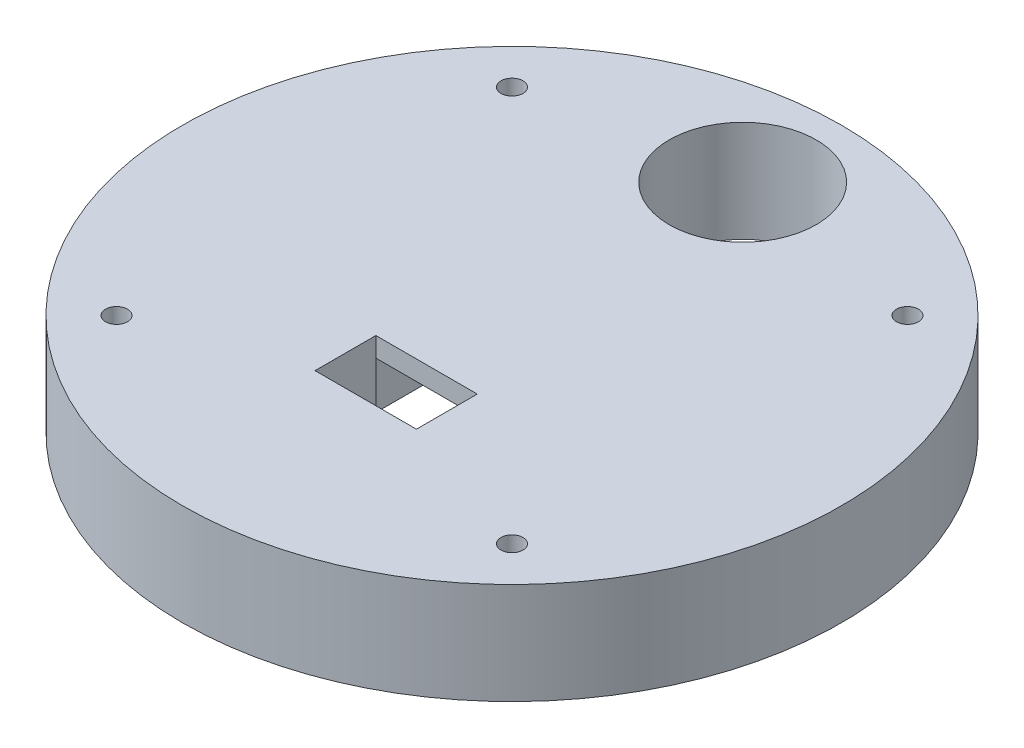
ISO-10303-21;
HEADER;
FILE_DESCRIPTION(('STEP AP214'),'2;1');
FILE_NAME('part.step','',(''),(''),'','','');
FILE_SCHEMA(('AUTOMOTIVE_DESIGN { 1 0 10303 214 1 1 1 1 }'));
ENDSEC;
DATA;
#1=APPLICATION_CONTEXT('core data for automotive mechanical design processes');
#2=APPLICATION_PROTOCOL_DEFINITION('international standard','automotive_design',2000,#1);
#3=PRODUCT_CONTEXT('',#1,'mechanical');
#4=PRODUCT('Part','Part','',(#3));
#5=PRODUCT_RELATED_PRODUCT_CATEGORY('part','',(#4));
#6=PRODUCT_DEFINITION_FORMATION('','',#4);
#7=PRODUCT_DEFINITION_CONTEXT('part definition',#1,'design');
#8=PRODUCT_DEFINITION('design','',#6,#7);
#9=PRODUCT_DEFINITION_SHAPE('','',#8);
#10=(LENGTH_UNIT() NAMED_UNIT(*) SI_UNIT(.MILLI.,.METRE.));
#11=(NAMED_UNIT(*) PLANE_ANGLE_UNIT() SI_UNIT($,.RADIAN.));
#12=(NAMED_UNIT(*) SI_UNIT($,.STERADIAN.) SOLID_ANGLE_UNIT());
#13=UNCERTAINTY_MEASURE_WITH_UNIT(LENGTH_MEASURE(1.E-05),#10,'distance_accuracy_value','');
#14=(GEOMETRIC_REPRESENTATION_CONTEXT(3) GLOBAL_UNCERTAINTY_ASSIGNED_CONTEXT((#13)) GLOBAL_UNIT_ASSIGNED_CONTEXT((#10,
#11,#12)) REPRESENTATION_CONTEXT('',''));
#15=CARTESIAN_POINT('',(0.,0.,0.));
#16=DIRECTION('',(0.,0.,1.));
#17=DIRECTION('',(1.,0.,0.));
#18=AXIS2_PLACEMENT_3D('',#15,#16,#17);
#19=CARTESIAN_POINT('',(0.,20.5,21.3995));
#20=DIRECTION('',(0.,0.,1.));
#21=DIRECTION('',(1.,0.,0.));
#22=AXIS2_PLACEMENT_3D('',#19,#20,#21);
#23=PLANE('',#22);
#24=DIRECTION('',(-1.,0.,0.));
#25=VECTOR('',#24,1.);
#26=CARTESIAN_POINT('',(0.,20.5,21.3995));
#27=LINE('',#26,#25);
#28=CARTESIAN_POINT('',(-12.7,20.5,21.3995));
#29=VERTEX_POINT('',#28);
#30=CARTESIAN_POINT('',(-21.3995,20.5,21.3995));
#31=VERTEX_POINT('',#30);
#32=EDGE_CURVE('E182',#29,#31,#27,.T.);
#33=ORIENTED_EDGE('',*,*,#32,.F.);
#34=DIRECTION('',(0.,-1.,0.));
#35=VECTOR('',#34,1.);
#36=CARTESIAN_POINT('',(-12.7,25.4,21.3995));
#37=LINE('',#36,#35);
#38=CARTESIAN_POINT('',(-12.7,0.,21.3995));
#39=VERTEX_POINT('',#38);
#40=EDGE_CURVE('E126',#29,#39,#37,.T.);
#41=ORIENTED_EDGE('',*,*,#40,.T.);
#42=DIRECTION('',(-1.,0.,0.));
#43=VECTOR('',#42,1.);
#44=CARTESIAN_POINT('',(0.,0.,21.3995));
#45=LINE('',#44,#43);
#46=CARTESIAN_POINT('',(-21.3995,0.,21.3995));
#47=VERTEX_POINT('',#46);
#48=EDGE_CURVE('E200',#39,#47,#45,.T.);
#49=ORIENTED_EDGE('',*,*,#48,.T.);
#50=DIRECTION('',(0.,-1.,0.));
#51=VECTOR('',#50,1.);
#52=CARTESIAN_POINT('',(-21.3995,20.5,21.3995));
#53=LINE('',#52,#51);
#54=EDGE_CURVE('E214',#31,#47,#53,.T.);
#55=ORIENTED_EDGE('',*,*,#54,.F.);
#56=EDGE_LOOP('',(#33,#41,#49,#55));
#57=FACE_BOUND('',#56,.T.);
#58=ADVANCED_FACE('F47',(#57),#23,.F.);
#59=CARTESIAN_POINT('',(0.,0.,0.));
#60=DIRECTION('',(0.,1.,0.));
#61=DIRECTION('',(0.,0.,1.));
#62=AXIS2_PLACEMENT_3D('',#59,#60,#61);
#63=PLANE('',#62);
#64=CARTESIAN_POINT('',(49.53,0.,49.53));
#65=DIRECTION('',(0.,1.,0.));
#66=DIRECTION('',(0.,0.,1.));
#67=AXIS2_PLACEMENT_3D('',#64,#65,#66);
#68=CIRCLE('',#67,2.75);
#69=CARTESIAN_POINT('',(49.53,0.,52.28));
#70=VERTEX_POINT('',#69);
#71=EDGE_CURVE('E598',#70,#70,#68,.T.);
#72=ORIENTED_EDGE('',*,*,#71,.T.);
#73=EDGE_LOOP('',(#72));
#74=FACE_BOUND('',#73,.T.);
#75=CARTESIAN_POINT('',(-49.53,0.,-49.53));
#76=DIRECTION('',(0.,1.,0.));
#77=DIRECTION('',(0.,0.,1.));
#78=AXIS2_PLACEMENT_3D('',#75,#76,#77);
#79=CIRCLE('',#78,2.75);
#80=CARTESIAN_POINT('',(-49.53,0.,-46.78));
#81=VERTEX_POINT('',#80);
#82=EDGE_CURVE('E590',#81,#81,#79,.T.);
#83=ORIENTED_EDGE('',*,*,#82,.T.);
#84=EDGE_LOOP('',(#83));
#85=FACE_BOUND('',#84,.T.);
#86=CARTESIAN_POINT('',(49.53,0.,-49.53));
#87=DIRECTION('',(0.,1.,0.));
#88=DIRECTION('',(0.,0.,1.));
#89=AXIS2_PLACEMENT_3D('',#86,#87,#88);
#90=CIRCLE('',#89,2.75);
#91=CARTESIAN_POINT('',(49.53,0.,-46.78));
#92=VERTEX_POINT('',#91);
#93=EDGE_CURVE('E584',#92,#92,#90,.T.);
#94=ORIENTED_EDGE('',*,*,#93,.T.);
#95=EDGE_LOOP('',(#94));
#96=FACE_BOUND('',#95,.T.);
#97=CARTESIAN_POINT('',(-49.53,0.,49.53));
#98=DIRECTION('',(0.,1.,0.));
#99=DIRECTION('',(0.,0.,1.));
#100=AXIS2_PLACEMENT_3D('',#97,#98,#99);
#101=CIRCLE('',#100,2.75);
#102=CARTESIAN_POINT('',(-49.53,0.,52.28));
#103=VERTEX_POINT('',#102);
#104=EDGE_CURVE('E150',#103,#103,#101,.T.);
#105=ORIENTED_EDGE('',*,*,#104,.T.);
#106=EDGE_LOOP('',(#105));
#107=FACE_BOUND('',#106,.T.);
#108=CARTESIAN_POINT('',(0.,0.,0.));
#109=DIRECTION('',(0.,1.,0.));
#110=DIRECTION('',(0.,0.,1.));
#111=AXIS2_PLACEMENT_3D('',#108,#109,#110);
#112=CIRCLE('',#111,82.55);
#113=CARTESIAN_POINT('',(0.,0.,82.55));
#114=VERTEX_POINT('',#113);
#115=EDGE_CURVE('E51',#114,#114,#112,.T.);
#116=ORIENTED_EDGE('',*,*,#115,.F.);
#117=EDGE_LOOP('',(#116));
#118=FACE_BOUND('',#117,.T.);
#119=CARTESIAN_POINT('',(0.,0.,-57.785));
#120=DIRECTION('',(0.,1.,0.));
#121=DIRECTION('',(0.,0.,1.));
#122=AXIS2_PLACEMENT_3D('',#119,#120,#121);
#123=CIRCLE('',#122,18.415);
#124=CARTESIAN_POINT('',(0.,0.,-39.37));
#125=VERTEX_POINT('',#124);
#126=EDGE_CURVE('E222',#125,#125,#123,.T.);
#127=ORIENTED_EDGE('',*,*,#126,.T.);
#128=EDGE_LOOP('',(#127));
#129=FACE_BOUND('',#128,.T.);
#130=ORIENTED_EDGE('',*,*,#48,.F.);
#131=DIRECTION('',(0.,0.,-1.));
#132=VECTOR('',#131,1.);
#133=CARTESIAN_POINT('',(-12.7,0.,21.3995));
#134=LINE('',#133,#132);
#135=CARTESIAN_POINT('',(-12.7,0.,36.6395));
#136=VERTEX_POINT('',#135);
#137=EDGE_CURVE('E157',#136,#39,#134,.T.);
#138=ORIENTED_EDGE('',*,*,#137,.F.);
#139=DIRECTION('',(-1.,0.,0.));
#140=VECTOR('',#139,1.);
#141=CARTESIAN_POINT('',(-12.7,0.,36.6395));
#142=LINE('',#141,#140);
#143=CARTESIAN_POINT('',(12.7,0.,36.6395));
#144=VERTEX_POINT('',#143);
#145=EDGE_CURVE('E143',#144,#136,#142,.T.);
#146=ORIENTED_EDGE('',*,*,#145,.F.);
#147=DIRECTION('',(0.,0.,1.));
#148=VECTOR('',#147,1.);
#149=CARTESIAN_POINT('',(12.7,0.,21.3995));
#150=LINE('',#149,#148);
#151=CARTESIAN_POINT('',(12.7,0.,21.3995));
#152=VERTEX_POINT('',#151);
#153=EDGE_CURVE('E147',#152,#144,#150,.T.);
#154=ORIENTED_EDGE('',*,*,#153,.F.);
#155=CARTESIAN_POINT('',(21.3995,0.,21.3995));
#156=VERTEX_POINT('',#155);
#157=EDGE_CURVE('E201',#156,#152,#45,.T.);
#158=ORIENTED_EDGE('',*,*,#157,.F.);
#159=DIRECTION('',(0.,0.,1.));
#160=VECTOR('',#159,1.);
#161=CARTESIAN_POINT('',(21.3995,0.,0.));
#162=LINE('',#161,#160);
#163=CARTESIAN_POINT('',(21.3995,0.,-21.3995));
#164=VERTEX_POINT('',#163);
#165=EDGE_CURVE('E178',#164,#156,#162,.T.);
#166=ORIENTED_EDGE('',*,*,#165,.F.);
#167=DIRECTION('',(-1.,0.,0.));
#168=VECTOR('',#167,1.);
#169=CARTESIAN_POINT('',(0.,0.,-21.3995));
#170=LINE('',#169,#168);
#171=CARTESIAN_POINT('',(-21.3995,0.,-21.3995));
#172=VERTEX_POINT('',#171);
#173=EDGE_CURVE('E167',#164,#172,#170,.T.);
#174=ORIENTED_EDGE('',*,*,#173,.T.);
#175=DIRECTION('',(0.,0.,1.));
#176=VECTOR('',#175,1.);
#177=CARTESIAN_POINT('',(-21.3995,0.,0.));
#178=LINE('',#177,#176);
#179=EDGE_CURVE('E196',#172,#47,#178,.T.);
#180=ORIENTED_EDGE('',*,*,#179,.T.);
#181=EDGE_LOOP('',(#130,#138,#146,#154,#158,#166,#174,#180));
#182=FACE_BOUND('',#181,.T.);
#183=ADVANCED_FACE('F235',(#74,#85,#96,#107,#118,#129,#182),#63,.F.);
#184=CARTESIAN_POINT('',(0.,25.4,-57.785));
#185=DIRECTION('',(0.,-1.,0.));
#186=DIRECTION('',(0.,0.,-1.));
#187=AXIS2_PLACEMENT_3D('',#184,#185,#186);
#188=CYLINDRICAL_SURFACE('',#187,18.415);
#189=CARTESIAN_POINT('',(0.,25.4,-57.785));
#190=DIRECTION('',(0.,1.,0.));
#191=DIRECTION('',(0.,0.,1.));
#192=AXIS2_PLACEMENT_3D('',#189,#190,#191);
#193=CIRCLE('',#192,18.415);
#194=CARTESIAN_POINT('',(0.,25.4,-39.37));
#195=VERTEX_POINT('',#194);
#196=EDGE_CURVE('E57',#195,#195,#193,.T.);
#197=ORIENTED_EDGE('',*,*,#196,.T.);
#198=EDGE_LOOP('',(#197));
#199=FACE_BOUND('',#198,.T.);
#200=ORIENTED_EDGE('',*,*,#126,.F.);
#201=EDGE_LOOP('',(#200));
#202=FACE_BOUND('',#201,.T.);
#203=ADVANCED_FACE('F49',(#199,#202),#188,.F.);
#204=CARTESIAN_POINT('',(0.,25.4,0.));
#205=DIRECTION('',(0.,-1.,0.));
#206=DIRECTION('',(0.,0.,-1.));
#207=AXIS2_PLACEMENT_3D('',#204,#205,#206);
#208=CYLINDRICAL_SURFACE('',#207,82.55);
#209=CARTESIAN_POINT('',(0.,25.4,0.));
#210=DIRECTION('',(0.,1.,0.));
#211=DIRECTION('',(0.,0.,1.));
#212=AXIS2_PLACEMENT_3D('',#209,#210,#211);
#213=CIRCLE('',#212,82.55);
#214=CARTESIAN_POINT('',(0.,25.4,82.55));
#215=VERTEX_POINT('',#214);
#216=EDGE_CURVE('E11',#215,#215,#213,.T.);
#217=ORIENTED_EDGE('',*,*,#216,.F.);
#218=EDGE_LOOP('',(#217));
#219=FACE_BOUND('',#218,.T.);
#220=ORIENTED_EDGE('',*,*,#115,.T.);
#221=EDGE_LOOP('',(#220));
#222=FACE_BOUND('',#221,.T.);
#223=ADVANCED_FACE('F233',(#219,#222),#208,.T.);
#224=CARTESIAN_POINT('',(0.,25.4,0.));
#225=DIRECTION('',(0.,1.,0.));
#226=DIRECTION('',(0.,0.,1.));
#227=AXIS2_PLACEMENT_3D('',#224,#225,#226);
#228=PLANE('',#227);
#229=CARTESIAN_POINT('',(49.53,25.4,-49.53));
#230=DIRECTION('',(0.,1.,0.));
#231=DIRECTION('',(0.,0.,1.));
#232=AXIS2_PLACEMENT_3D('',#229,#230,#231);
#233=CIRCLE('',#232,2.75);
#234=CARTESIAN_POINT('',(49.53,25.4,-46.78));
#235=VERTEX_POINT('',#234);
#236=EDGE_CURVE('E560',#235,#235,#233,.T.);
#237=ORIENTED_EDGE('',*,*,#236,.F.);
#238=EDGE_LOOP('',(#237));
#239=FACE_BOUND('',#238,.T.);
#240=CARTESIAN_POINT('',(-49.53,25.4,49.53));
#241=DIRECTION('',(0.,1.,0.));
#242=DIRECTION('',(0.,0.,1.));
#243=AXIS2_PLACEMENT_3D('',#240,#241,#242);
#244=CIRCLE('',#243,2.75);
#245=CARTESIAN_POINT('',(-49.53,25.4,52.28));
#246=VERTEX_POINT('',#245);
#247=EDGE_CURVE('E577',#246,#246,#244,.T.);
#248=ORIENTED_EDGE('',*,*,#247,.F.);
#249=EDGE_LOOP('',(#248));
#250=FACE_BOUND('',#249,.T.);
#251=CARTESIAN_POINT('',(49.53,25.4,49.53));
#252=DIRECTION('',(0.,1.,0.));
#253=DIRECTION('',(0.,0.,1.));
#254=AXIS2_PLACEMENT_3D('',#251,#252,#253);
#255=CIRCLE('',#254,2.75);
#256=CARTESIAN_POINT('',(49.53,25.4,52.28));
#257=VERTEX_POINT('',#256);
#258=EDGE_CURVE('E571',#257,#257,#255,.T.);
#259=ORIENTED_EDGE('',*,*,#258,.F.);
#260=EDGE_LOOP('',(#259));
#261=FACE_BOUND('',#260,.T.);
#262=CARTESIAN_POINT('',(-49.53,25.4,-49.53));
#263=DIRECTION('',(0.,1.,0.));
#264=DIRECTION('',(0.,0.,1.));
#265=AXIS2_PLACEMENT_3D('',#262,#263,#264);
#266=CIRCLE('',#265,2.75);
#267=CARTESIAN_POINT('',(-49.53,25.4,-46.78));
#268=VERTEX_POINT('',#267);
#269=EDGE_CURVE('E559',#268,#268,#266,.T.);
#270=ORIENTED_EDGE('',*,*,#269,.F.);
#271=EDGE_LOOP('',(#270));
#272=FACE_BOUND('',#271,.T.);
#273=DIRECTION('',(0.,0.,-1.));
#274=VECTOR('',#273,1.);
#275=CARTESIAN_POINT('',(-12.7,25.4,21.3995));
#276=LINE('',#275,#274);
#277=CARTESIAN_POINT('',(-12.7,25.4,36.6395));
#278=VERTEX_POINT('',#277);
#279=CARTESIAN_POINT('',(-12.7,25.4,21.3995));
#280=VERTEX_POINT('',#279);
#281=EDGE_CURVE('E123',#278,#280,#276,.T.);
#282=ORIENTED_EDGE('',*,*,#281,.T.);
#283=DIRECTION('',(1.,0.,0.));
#284=VECTOR('',#283,1.);
#285=CARTESIAN_POINT('',(-12.7,25.4,21.3995));
#286=LINE('',#285,#284);
#287=CARTESIAN_POINT('',(12.7,25.4,21.3995));
#288=VERTEX_POINT('',#287);
#289=EDGE_CURVE('E132',#280,#288,#286,.T.);
#290=ORIENTED_EDGE('',*,*,#289,.T.);
#291=DIRECTION('',(0.,0.,1.));
#292=VECTOR('',#291,1.);
#293=CARTESIAN_POINT('',(12.7,25.4,21.3995));
#294=LINE('',#293,#292);
#295=CARTESIAN_POINT('',(12.7,25.4,36.6395));
#296=VERTEX_POINT('',#295);
#297=EDGE_CURVE('E65',#288,#296,#294,.T.);
#298=ORIENTED_EDGE('',*,*,#297,.T.);
#299=DIRECTION('',(-1.,0.,0.));
#300=VECTOR('',#299,1.);
#301=CARTESIAN_POINT('',(-12.7,25.4,36.6395));
#302=LINE('',#301,#300);
#303=EDGE_CURVE('E141',#296,#278,#302,.T.);
#304=ORIENTED_EDGE('',*,*,#303,.T.);
#305=EDGE_LOOP('',(#282,#290,#298,#304));
#306=FACE_BOUND('',#305,.T.);
#307=ORIENTED_EDGE('',*,*,#196,.F.);
#308=EDGE_LOOP('',(#307));
#309=FACE_BOUND('',#308,.T.);
#310=ORIENTED_EDGE('',*,*,#216,.T.);
#311=EDGE_LOOP('',(#310));
#312=FACE_BOUND('',#311,.T.);
#313=ADVANCED_FACE('F138',(#239,#250,#261,#272,#306,#309,#312),#228,.T.);
#314=CARTESIAN_POINT('',(0.,20.5,-21.3995));
#315=DIRECTION('',(0.,0.,1.));
#316=DIRECTION('',(1.,0.,0.));
#317=AXIS2_PLACEMENT_3D('',#314,#315,#316);
#318=PLANE('',#317);
#319=ORIENTED_EDGE('',*,*,#173,.F.);
#320=DIRECTION('',(0.,-1.,0.));
#321=VECTOR('',#320,1.);
#322=CARTESIAN_POINT('',(21.3995,20.5,-21.3995));
#323=LINE('',#322,#321);
#324=CARTESIAN_POINT('',(21.3995,20.5,-21.3995));
#325=VERTEX_POINT('',#324);
#326=EDGE_CURVE('E192',#325,#164,#323,.T.);
#327=ORIENTED_EDGE('',*,*,#326,.F.);
#328=DIRECTION('',(-1.,0.,0.));
#329=VECTOR('',#328,1.);
#330=CARTESIAN_POINT('',(0.,20.5,-21.3995));
#331=LINE('',#330,#329);
#332=CARTESIAN_POINT('',(-21.3995,20.5,-21.3995));
#333=VERTEX_POINT('',#332);
#334=EDGE_CURVE('E173',#325,#333,#331,.T.);
#335=ORIENTED_EDGE('',*,*,#334,.T.);
#336=DIRECTION('',(0.,-1.,0.));
#337=VECTOR('',#336,1.);
#338=CARTESIAN_POINT('',(-21.3995,20.5,-21.3995));
#339=LINE('',#338,#337);
#340=EDGE_CURVE('E218',#333,#172,#339,.T.);
#341=ORIENTED_EDGE('',*,*,#340,.T.);
#342=EDGE_LOOP('',(#319,#327,#335,#341));
#343=FACE_BOUND('',#342,.T.);
#344=ADVANCED_FACE('F289',(#343),#318,.T.);
#345=CARTESIAN_POINT('',(-21.3995,20.5,0.));
#346=DIRECTION('',(1.,0.,0.));
#347=DIRECTION('',(0.,0.,-1.));
#348=AXIS2_PLACEMENT_3D('',#345,#346,#347);
#349=PLANE('',#348);
#350=ORIENTED_EDGE('',*,*,#179,.F.);
#351=ORIENTED_EDGE('',*,*,#340,.F.);
#352=DIRECTION('',(0.,0.,1.));
#353=VECTOR('',#352,1.);
#354=CARTESIAN_POINT('',(-21.3995,20.5,0.));
#355=LINE('',#354,#353);
#356=EDGE_CURVE('E177',#333,#31,#355,.T.);
#357=ORIENTED_EDGE('',*,*,#356,.T.);
#358=ORIENTED_EDGE('',*,*,#54,.T.);
#359=EDGE_LOOP('',(#350,#351,#357,#358));
#360=FACE_BOUND('',#359,.T.);
#361=ADVANCED_FACE('F283',(#360),#349,.T.);
#362=ORIENTED_EDGE('',*,*,#157,.T.);
#363=DIRECTION('',(0.,-1.,0.));
#364=VECTOR('',#363,1.);
#365=CARTESIAN_POINT('',(12.7,25.4,21.3995));
#366=LINE('',#365,#364);
#367=CARTESIAN_POINT('',(12.7,20.5,21.3995));
#368=VERTEX_POINT('',#367);
#369=EDGE_CURVE('E129',#368,#152,#366,.T.);
#370=ORIENTED_EDGE('',*,*,#369,.F.);
#371=CARTESIAN_POINT('',(21.3995,20.5,21.3995));
#372=VERTEX_POINT('',#371);
#373=EDGE_CURVE('E183',#372,#368,#27,.T.);
#374=ORIENTED_EDGE('',*,*,#373,.F.);
#375=DIRECTION('',(0.,-1.,0.));
#376=VECTOR('',#375,1.);
#377=CARTESIAN_POINT('',(21.3995,20.5,21.3995));
#378=LINE('',#377,#376);
#379=EDGE_CURVE('E211',#372,#156,#378,.T.);
#380=ORIENTED_EDGE('',*,*,#379,.T.);
#381=EDGE_LOOP('',(#362,#370,#374,#380));
#382=FACE_BOUND('',#381,.T.);
#383=ADVANCED_FACE('F259',(#382),#23,.F.);
#384=CARTESIAN_POINT('',(21.3995,20.5,0.));
#385=DIRECTION('',(1.,0.,0.));
#386=DIRECTION('',(0.,0.,-1.));
#387=AXIS2_PLACEMENT_3D('',#384,#385,#386);
#388=PLANE('',#387);
#389=ORIENTED_EDGE('',*,*,#165,.T.);
#390=ORIENTED_EDGE('',*,*,#379,.F.);
#391=DIRECTION('',(0.,0.,1.));
#392=VECTOR('',#391,1.);
#393=CARTESIAN_POINT('',(21.3995,20.5,0.));
#394=LINE('',#393,#392);
#395=EDGE_CURVE('E187',#325,#372,#394,.T.);
#396=ORIENTED_EDGE('',*,*,#395,.F.);
#397=ORIENTED_EDGE('',*,*,#326,.T.);
#398=EDGE_LOOP('',(#389,#390,#396,#397));
#399=FACE_BOUND('',#398,.T.);
#400=ADVANCED_FACE('F282',(#399),#388,.F.);
#401=CARTESIAN_POINT('',(0.,20.5,0.));
#402=DIRECTION('',(0.,1.,0.));
#403=DIRECTION('',(0.,0.,1.));
#404=AXIS2_PLACEMENT_3D('',#401,#402,#403);
#405=PLANE('',#404);
#406=ORIENTED_EDGE('',*,*,#334,.F.);
#407=ORIENTED_EDGE('',*,*,#395,.T.);
#408=ORIENTED_EDGE('',*,*,#373,.T.);
#409=EDGE_CURVE('E188',#368,#29,#27,.T.);
#410=ORIENTED_EDGE('',*,*,#409,.T.);
#411=ORIENTED_EDGE('',*,*,#32,.T.);
#412=ORIENTED_EDGE('',*,*,#356,.F.);
#413=EDGE_LOOP('',(#406,#407,#408,#410,#411,#412));
#414=FACE_BOUND('',#413,.T.);
#415=ADVANCED_FACE('F252',(#414),#405,.F.);
#416=CARTESIAN_POINT('',(-12.7,25.4,21.3995));
#417=DIRECTION('',(0.,0.,-1.));
#418=DIRECTION('',(-1.,0.,0.));
#419=AXIS2_PLACEMENT_3D('',#416,#417,#418);
#420=PLANE('',#419);
#421=EDGE_CURVE('E134',#288,#368,#366,.T.);
#422=ORIENTED_EDGE('',*,*,#421,.F.);
#423=ORIENTED_EDGE('',*,*,#289,.F.);
#424=EDGE_CURVE('E73',#280,#29,#37,.T.);
#425=ORIENTED_EDGE('',*,*,#424,.T.);
#426=ORIENTED_EDGE('',*,*,#409,.F.);
#427=EDGE_LOOP('',(#422,#423,#425,#426));
#428=FACE_BOUND('',#427,.T.);
#429=ADVANCED_FACE('F133',(#428),#420,.F.);
#430=CARTESIAN_POINT('',(-12.7,25.4,21.3995));
#431=DIRECTION('',(-1.,0.,0.));
#432=DIRECTION('',(0.,0.,1.));
#433=AXIS2_PLACEMENT_3D('',#430,#431,#432);
#434=PLANE('',#433);
#435=ORIENTED_EDGE('',*,*,#137,.T.);
#436=ORIENTED_EDGE('',*,*,#40,.F.);
#437=ORIENTED_EDGE('',*,*,#424,.F.);
#438=ORIENTED_EDGE('',*,*,#281,.F.);
#439=DIRECTION('',(0.,-1.,0.));
#440=VECTOR('',#439,1.);
#441=CARTESIAN_POINT('',(-12.7,25.4,36.6395));
#442=LINE('',#441,#440);
#443=EDGE_CURVE('E164',#278,#136,#442,.T.);
#444=ORIENTED_EDGE('',*,*,#443,.T.);
#445=EDGE_LOOP('',(#435,#436,#437,#438,#444));
#446=FACE_BOUND('',#445,.T.);
#447=ADVANCED_FACE('F121',(#446),#434,.F.);
#448=CARTESIAN_POINT('',(-12.7,25.4,36.6395));
#449=DIRECTION('',(0.,0.,1.));
#450=DIRECTION('',(1.,0.,0.));
#451=AXIS2_PLACEMENT_3D('',#448,#449,#450);
#452=PLANE('',#451);
#453=ORIENTED_EDGE('',*,*,#145,.T.);
#454=ORIENTED_EDGE('',*,*,#443,.F.);
#455=ORIENTED_EDGE('',*,*,#303,.F.);
#456=DIRECTION('',(0.,-1.,0.));
#457=VECTOR('',#456,1.);
#458=CARTESIAN_POINT('',(12.7,25.4,36.6395));
#459=LINE('',#458,#457);
#460=EDGE_CURVE('E168',#296,#144,#459,.T.);
#461=ORIENTED_EDGE('',*,*,#460,.T.);
#462=EDGE_LOOP('',(#453,#454,#455,#461));
#463=FACE_BOUND('',#462,.T.);
#464=ADVANCED_FACE('F263',(#463),#452,.F.);
#465=CARTESIAN_POINT('',(12.7,25.4,21.3995));
#466=DIRECTION('',(1.,0.,0.));
#467=DIRECTION('',(0.,0.,-1.));
#468=AXIS2_PLACEMENT_3D('',#465,#466,#467);
#469=PLANE('',#468);
#470=ORIENTED_EDGE('',*,*,#153,.T.);
#471=ORIENTED_EDGE('',*,*,#460,.F.);
#472=ORIENTED_EDGE('',*,*,#297,.F.);
#473=ORIENTED_EDGE('',*,*,#421,.T.);
#474=ORIENTED_EDGE('',*,*,#369,.T.);
#475=EDGE_LOOP('',(#470,#471,#472,#473,#474));
#476=FACE_BOUND('',#475,.T.);
#477=ADVANCED_FACE('F256',(#476),#469,.F.);
#478=CARTESIAN_POINT('',(-49.53,6.,49.53));
#479=DIRECTION('',(0.,-1.,0.));
#480=DIRECTION('',(0.,0.,-1.));
#481=AXIS2_PLACEMENT_3D('',#478,#479,#480);
#482=CYLINDRICAL_SURFACE('',#481,2.75);
#483=CARTESIAN_POINT('',(-49.53,6.,49.53));
#484=DIRECTION('',(0.,1.,0.));
#485=DIRECTION('',(0.,0.,1.));
#486=AXIS2_PLACEMENT_3D('',#483,#484,#485);
#487=CIRCLE('',#486,2.75);
#488=CARTESIAN_POINT('',(-49.53,6.,52.28));
#489=VERTEX_POINT('',#488);
#490=EDGE_CURVE('E160',#489,#489,#487,.T.);
#491=ORIENTED_EDGE('',*,*,#490,.T.);
#492=EDGE_LOOP('',(#491));
#493=FACE_BOUND('',#492,.T.);
#494=ORIENTED_EDGE('',*,*,#104,.F.);
#495=EDGE_LOOP('',(#494));
#496=FACE_BOUND('',#495,.T.);
#497=ADVANCED_FACE('F270',(#493,#496),#482,.F.);
#498=CARTESIAN_POINT('',(0.,6.,0.));
#499=DIRECTION('',(0.,1.,0.));
#500=DIRECTION('',(0.,0.,1.));
#501=AXIS2_PLACEMENT_3D('',#498,#499,#500);
#502=PLANE('',#501);
#503=ORIENTED_EDGE('',*,*,#490,.F.);
#504=EDGE_LOOP('',(#503));
#505=FACE_BOUND('',#504,.T.);
#506=ADVANCED_FACE('F405',(#505),#502,.F.);
#507=CARTESIAN_POINT('',(49.53,6.,-49.53));
#508=DIRECTION('',(0.,-1.,0.));
#509=DIRECTION('',(0.,0.,-1.));
#510=AXIS2_PLACEMENT_3D('',#507,#508,#509);
#511=CYLINDRICAL_SURFACE('',#510,2.75);
#512=CARTESIAN_POINT('',(49.53,6.,-49.53));
#513=DIRECTION('',(0.,1.,0.));
#514=DIRECTION('',(0.,0.,1.));
#515=AXIS2_PLACEMENT_3D('',#512,#513,#514);
#516=CIRCLE('',#515,2.75);
#517=CARTESIAN_POINT('',(49.53,6.,-46.78));
#518=VERTEX_POINT('',#517);
#519=EDGE_CURVE('E586',#518,#518,#516,.T.);
#520=ORIENTED_EDGE('',*,*,#519,.T.);
#521=EDGE_LOOP('',(#520));
#522=FACE_BOUND('',#521,.T.);
#523=ORIENTED_EDGE('',*,*,#93,.F.);
#524=EDGE_LOOP('',(#523));
#525=FACE_BOUND('',#524,.T.);
#526=ADVANCED_FACE('F414',(#522,#525),#511,.F.);
#527=CARTESIAN_POINT('',(0.,6.,0.));
#528=DIRECTION('',(0.,1.,0.));
#529=DIRECTION('',(0.,0.,1.));
#530=AXIS2_PLACEMENT_3D('',#527,#528,#529);
#531=PLANE('',#530);
#532=ORIENTED_EDGE('',*,*,#519,.F.);
#533=EDGE_LOOP('',(#532));
#534=FACE_BOUND('',#533,.T.);
#535=ADVANCED_FACE('F424',(#534),#531,.F.);
#536=CARTESIAN_POINT('',(-49.53,6.,-49.53));
#537=DIRECTION('',(0.,-1.,0.));
#538=DIRECTION('',(0.,0.,-1.));
#539=AXIS2_PLACEMENT_3D('',#536,#537,#538);
#540=CYLINDRICAL_SURFACE('',#539,2.75);
#541=CARTESIAN_POINT('',(-49.53,6.,-49.53));
#542=DIRECTION('',(0.,1.,0.));
#543=DIRECTION('',(0.,0.,1.));
#544=AXIS2_PLACEMENT_3D('',#541,#542,#543);
#545=CIRCLE('',#544,2.75);
#546=CARTESIAN_POINT('',(-49.53,6.,-46.78));
#547=VERTEX_POINT('',#546);
#548=EDGE_CURVE('E602',#547,#547,#545,.T.);
#549=ORIENTED_EDGE('',*,*,#548,.T.);
#550=EDGE_LOOP('',(#549));
#551=FACE_BOUND('',#550,.T.);
#552=ORIENTED_EDGE('',*,*,#82,.F.);
#553=EDGE_LOOP('',(#552));
#554=FACE_BOUND('',#553,.T.);
#555=ADVANCED_FACE('F434',(#551,#554),#540,.F.);
#556=CARTESIAN_POINT('',(0.,6.,0.));
#557=DIRECTION('',(0.,1.,0.));
#558=DIRECTION('',(0.,0.,1.));
#559=AXIS2_PLACEMENT_3D('',#556,#557,#558);
#560=PLANE('',#559);
#561=ORIENTED_EDGE('',*,*,#548,.F.);
#562=EDGE_LOOP('',(#561));
#563=FACE_BOUND('',#562,.T.);
#564=ADVANCED_FACE('F444',(#563),#560,.F.);
#565=CARTESIAN_POINT('',(49.53,6.,49.53));
#566=DIRECTION('',(0.,-1.,0.));
#567=DIRECTION('',(0.,0.,-1.));
#568=AXIS2_PLACEMENT_3D('',#565,#566,#567);
#569=CYLINDRICAL_SURFACE('',#568,2.75);
#570=CARTESIAN_POINT('',(49.53,6.,49.53));
#571=DIRECTION('',(0.,1.,0.));
#572=DIRECTION('',(0.,0.,1.));
#573=AXIS2_PLACEMENT_3D('',#570,#571,#572);
#574=CIRCLE('',#573,2.75);
#575=CARTESIAN_POINT('',(49.53,6.,52.28));
#576=VERTEX_POINT('',#575);
#577=EDGE_CURVE('E594',#576,#576,#574,.T.);
#578=ORIENTED_EDGE('',*,*,#577,.T.);
#579=EDGE_LOOP('',(#578));
#580=FACE_BOUND('',#579,.T.);
#581=ORIENTED_EDGE('',*,*,#71,.F.);
#582=EDGE_LOOP('',(#581));
#583=FACE_BOUND('',#582,.T.);
#584=ADVANCED_FACE('F454',(#580,#583),#569,.F.);
#585=CARTESIAN_POINT('',(0.,6.,0.));
#586=DIRECTION('',(0.,1.,0.));
#587=DIRECTION('',(0.,0.,1.));
#588=AXIS2_PLACEMENT_3D('',#585,#586,#587);
#589=PLANE('',#588);
#590=ORIENTED_EDGE('',*,*,#577,.F.);
#591=EDGE_LOOP('',(#590));
#592=FACE_BOUND('',#591,.T.);
#593=ADVANCED_FACE('F464',(#592),#589,.F.);
#594=CARTESIAN_POINT('',(-49.53,19.4,-49.53));
#595=DIRECTION('',(0.,1.,0.));
#596=DIRECTION('',(0.,0.,1.));
#597=AXIS2_PLACEMENT_3D('',#594,#595,#596);
#598=CYLINDRICAL_SURFACE('',#597,2.75);
#599=CARTESIAN_POINT('',(-49.53,19.4,-49.53));
#600=DIRECTION('',(0.,1.,0.));
#601=DIRECTION('',(0.,0.,1.));
#602=AXIS2_PLACEMENT_3D('',#599,#600,#601);
#603=CIRCLE('',#602,2.75);
#604=CARTESIAN_POINT('',(-49.53,19.4,-46.78));
#605=VERTEX_POINT('',#604);
#606=EDGE_CURVE('E565',#605,#605,#603,.T.);
#607=ORIENTED_EDGE('',*,*,#606,.F.);
#608=EDGE_LOOP('',(#607));
#609=FACE_BOUND('',#608,.T.);
#610=ORIENTED_EDGE('',*,*,#269,.T.);
#611=EDGE_LOOP('',(#610));
#612=FACE_BOUND('',#611,.T.);
#613=ADVANCED_FACE('F473',(#609,#612),#598,.F.);
#614=CARTESIAN_POINT('',(0.,19.4,0.));
#615=DIRECTION('',(0.,1.,0.));
#616=DIRECTION('',(0.,0.,1.));
#617=AXIS2_PLACEMENT_3D('',#614,#615,#616);
#618=PLANE('',#617);
#619=ORIENTED_EDGE('',*,*,#606,.T.);
#620=EDGE_LOOP('',(#619));
#621=FACE_BOUND('',#620,.T.);
#622=ADVANCED_FACE('F482',(#621),#618,.T.);
#623=CARTESIAN_POINT('',(49.53,19.4,49.53));
#624=DIRECTION('',(0.,1.,0.));
#625=DIRECTION('',(0.,0.,1.));
#626=AXIS2_PLACEMENT_3D('',#623,#624,#625);
#627=CYLINDRICAL_SURFACE('',#626,2.75);
#628=CARTESIAN_POINT('',(49.53,19.4,49.53));
#629=DIRECTION('',(0.,1.,0.));
#630=DIRECTION('',(0.,0.,1.));
#631=AXIS2_PLACEMENT_3D('',#628,#629,#630);
#632=CIRCLE('',#631,2.75);
#633=CARTESIAN_POINT('',(49.53,19.4,52.28));
#634=VERTEX_POINT('',#633);
#635=EDGE_CURVE('E581',#634,#634,#632,.T.);
#636=ORIENTED_EDGE('',*,*,#635,.F.);
#637=EDGE_LOOP('',(#636));
#638=FACE_BOUND('',#637,.T.);
#639=ORIENTED_EDGE('',*,*,#258,.T.);
#640=EDGE_LOOP('',(#639));
#641=FACE_BOUND('',#640,.T.);
#642=ADVANCED_FACE('F492',(#638,#641),#627,.F.);
#643=CARTESIAN_POINT('',(0.,19.4,0.));
#644=DIRECTION('',(0.,1.,0.));
#645=DIRECTION('',(0.,0.,1.));
#646=AXIS2_PLACEMENT_3D('',#643,#644,#645);
#647=PLANE('',#646);
#648=ORIENTED_EDGE('',*,*,#635,.T.);
#649=EDGE_LOOP('',(#648));
#650=FACE_BOUND('',#649,.T.);
#651=ADVANCED_FACE('F502',(#650),#647,.T.);
#652=CARTESIAN_POINT('',(-49.53,19.4,49.53));
#653=DIRECTION('',(0.,1.,0.));
#654=DIRECTION('',(0.,0.,1.));
#655=AXIS2_PLACEMENT_3D('',#652,#653,#654);
#656=CYLINDRICAL_SURFACE('',#655,2.75);
#657=CARTESIAN_POINT('',(-49.53,19.4,49.53));
#658=DIRECTION('',(0.,1.,0.));
#659=DIRECTION('',(0.,0.,1.));
#660=AXIS2_PLACEMENT_3D('',#657,#658,#659);
#661=CIRCLE('',#660,2.75);
#662=CARTESIAN_POINT('',(-49.53,19.4,52.28));
#663=VERTEX_POINT('',#662);
#664=EDGE_CURVE('E568',#663,#663,#661,.T.);
#665=ORIENTED_EDGE('',*,*,#664,.F.);
#666=EDGE_LOOP('',(#665));
#667=FACE_BOUND('',#666,.T.);
#668=ORIENTED_EDGE('',*,*,#247,.T.);
#669=EDGE_LOOP('',(#668));
#670=FACE_BOUND('',#669,.T.);
#671=ADVANCED_FACE('F512',(#667,#670),#656,.F.);
#672=CARTESIAN_POINT('',(0.,19.4,0.));
#673=DIRECTION('',(0.,1.,0.));
#674=DIRECTION('',(0.,0.,1.));
#675=AXIS2_PLACEMENT_3D('',#672,#673,#674);
#676=PLANE('',#675);
#677=ORIENTED_EDGE('',*,*,#664,.T.);
#678=EDGE_LOOP('',(#677));
#679=FACE_BOUND('',#678,.T.);
#680=ADVANCED_FACE('F522',(#679),#676,.T.);
#681=CARTESIAN_POINT('',(49.53,19.4,-49.53));
#682=DIRECTION('',(0.,1.,0.));
#683=DIRECTION('',(0.,0.,1.));
#684=AXIS2_PLACEMENT_3D('',#681,#682,#683);
#685=CYLINDRICAL_SURFACE('',#684,2.75);
#686=CARTESIAN_POINT('',(49.53,19.4,-49.53));
#687=DIRECTION('',(0.,1.,0.));
#688=DIRECTION('',(0.,0.,1.));
#689=AXIS2_PLACEMENT_3D('',#686,#687,#688);
#690=CIRCLE('',#689,2.75);
#691=CARTESIAN_POINT('',(49.53,19.4,-46.78));
#692=VERTEX_POINT('',#691);
#693=EDGE_CURVE('E557',#692,#692,#690,.T.);
#694=ORIENTED_EDGE('',*,*,#693,.F.);
#695=EDGE_LOOP('',(#694));
#696=FACE_BOUND('',#695,.T.);
#697=ORIENTED_EDGE('',*,*,#236,.T.);
#698=EDGE_LOOP('',(#697));
#699=FACE_BOUND('',#698,.T.);
#700=ADVANCED_FACE('F532',(#696,#699),#685,.F.);
#701=CARTESIAN_POINT('',(0.,19.4,0.));
#702=DIRECTION('',(0.,1.,0.));
#703=DIRECTION('',(0.,0.,1.));
#704=AXIS2_PLACEMENT_3D('',#701,#702,#703);
#705=PLANE('',#704);
#706=ORIENTED_EDGE('',*,*,#693,.T.);
#707=EDGE_LOOP('',(#706));
#708=FACE_BOUND('',#707,.T.);
#709=ADVANCED_FACE('F542',(#708),#705,.T.);
#710=CLOSED_SHELL('',(#58,#183,#203,#223,#313,#344,#361,#383,#400,#415,#429,#447,#464,#477,#497,
#506,#526,#535,#555,#564,#584,#593,#613,#622,#642,#651,#671,#680,#700,#709));
#711=MANIFOLD_SOLID_BREP('B2',#710);
#712=ADVANCED_BREP_SHAPE_REPRESENTATION('',(#18,#711),#14);
#713=SHAPE_DEFINITION_REPRESENTATION(#9,#712);
ENDSEC;
END-ISO-10303-21;
